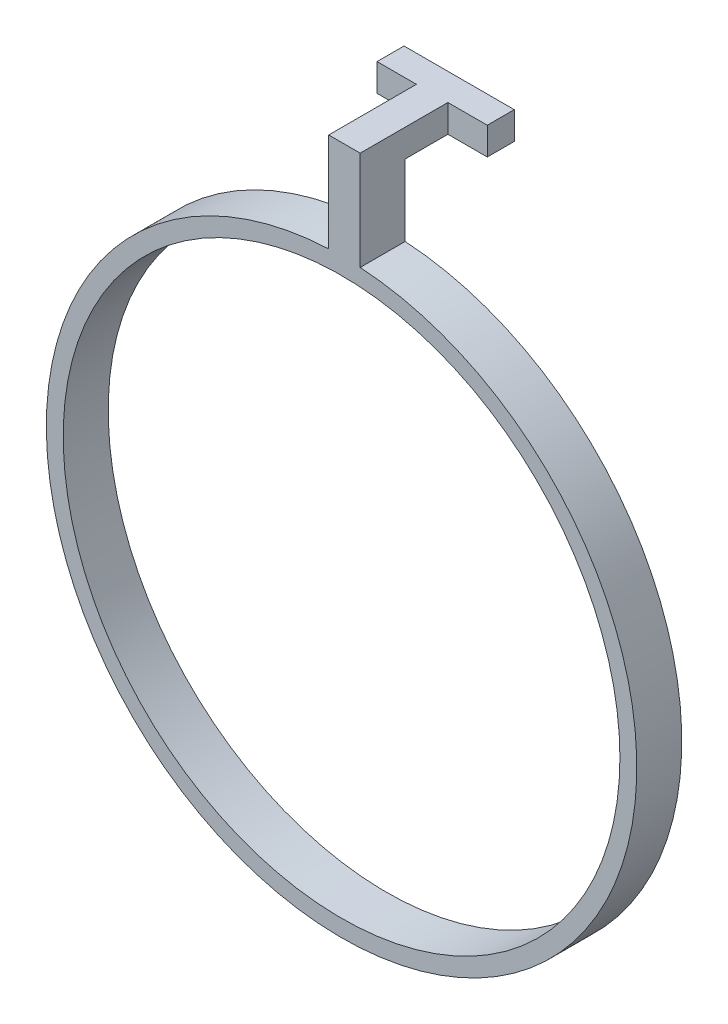
ISO-10303-21;
HEADER;
FILE_DESCRIPTION(('STEP AP214'),'2;1');
FILE_NAME('part.step','',(''),(''),'','','');
FILE_SCHEMA(('AUTOMOTIVE_DESIGN { 1 0 10303 214 1 1 1 1 }'));
ENDSEC;
DATA;
#1=APPLICATION_CONTEXT('core data for automotive mechanical design processes');
#2=APPLICATION_PROTOCOL_DEFINITION('international standard','automotive_design',2000,#1);
#3=PRODUCT_CONTEXT('',#1,'mechanical');
#4=PRODUCT('Part','Part','',(#3));
#5=PRODUCT_RELATED_PRODUCT_CATEGORY('part','',(#4));
#6=PRODUCT_DEFINITION_FORMATION('','',#4);
#7=PRODUCT_DEFINITION_CONTEXT('part definition',#1,'design');
#8=PRODUCT_DEFINITION('design','',#6,#7);
#9=PRODUCT_DEFINITION_SHAPE('','',#8);
#10=(LENGTH_UNIT() NAMED_UNIT(*) SI_UNIT(.MILLI.,.METRE.));
#11=(NAMED_UNIT(*) PLANE_ANGLE_UNIT() SI_UNIT($,.RADIAN.));
#12=(NAMED_UNIT(*) SI_UNIT($,.STERADIAN.) SOLID_ANGLE_UNIT());
#13=UNCERTAINTY_MEASURE_WITH_UNIT(LENGTH_MEASURE(1.E-05),#10,'distance_accuracy_value','');
#14=(GEOMETRIC_REPRESENTATION_CONTEXT(3) GLOBAL_UNCERTAINTY_ASSIGNED_CONTEXT((#13)) GLOBAL_UNIT_ASSIGNED_CONTEXT((#10,
#11,#12)) REPRESENTATION_CONTEXT('',''));
#15=CARTESIAN_POINT('',(0.,0.,0.));
#16=DIRECTION('',(0.,0.,1.));
#17=DIRECTION('',(1.,0.,0.));
#18=AXIS2_PLACEMENT_3D('',#15,#16,#17);
#19=CARTESIAN_POINT('',(0.,0.,0.));
#20=DIRECTION('',(0.,0.,1.));
#21=DIRECTION('',(1.,0.,0.));
#22=AXIS2_PLACEMENT_3D('',#19,#20,#21);
#23=PLANE('',#22);
#24=CARTESIAN_POINT('',(0.,0.,0.));
#25=DIRECTION('',(0.,0.,1.));
#26=DIRECTION('',(1.,0.,0.));
#27=AXIS2_PLACEMENT_3D('',#24,#25,#26);
#28=CIRCLE('',#27,24.75);
#29=CARTESIAN_POINT('',(24.75,0.,0.));
#30=VERTEX_POINT('',#29);
#31=EDGE_CURVE('E163',#30,#30,#28,.T.);
#32=ORIENTED_EDGE('',*,*,#31,.T.);
#33=EDGE_LOOP('',(#32));
#34=FACE_BOUND('',#33,.T.);
#35=DIRECTION('',(-1.,0.,0.));
#36=VECTOR('',#35,1.);
#37=CARTESIAN_POINT('',(1.65514018691589,32.55,0.));
#38=LINE('',#37,#36);
#39=CARTESIAN_POINT('',(1.65514018691589,32.55,0.));
#40=VERTEX_POINT('',#39);
#41=CARTESIAN_POINT('',(-1.14485981308411,32.55,0.));
#42=VERTEX_POINT('',#41);
#43=EDGE_CURVE('E52',#40,#42,#38,.T.);
#44=ORIENTED_EDGE('',*,*,#43,.F.);
#45=DIRECTION('',(0.,1.,0.));
#46=VECTOR('',#45,1.);
#47=CARTESIAN_POINT('',(1.65514018691589,35.,0.));
#48=LINE('',#47,#46);
#49=CARTESIAN_POINT('',(1.65514018691589,26.1977672896309,0.));
#50=VERTEX_POINT('',#49);
#51=EDGE_CURVE('E172',#50,#40,#48,.T.);
#52=ORIENTED_EDGE('',*,*,#51,.F.);
#53=CARTESIAN_POINT('',(0.,0.,0.));
#54=DIRECTION('',(0.,0.,1.));
#55=DIRECTION('',(1.,0.,0.));
#56=AXIS2_PLACEMENT_3D('',#53,#54,#55);
#57=CIRCLE('',#56,26.25);
#58=CARTESIAN_POINT('',(-1.14485981308411,26.2250223261752,0.));
#59=VERTEX_POINT('',#58);
#60=EDGE_CURVE('E76',#59,#50,#57,.T.);
#61=ORIENTED_EDGE('',*,*,#60,.F.);
#62=DIRECTION('',(0.,-1.,0.));
#63=VECTOR('',#62,1.);
#64=CARTESIAN_POINT('',(-1.14485981308411,35.,0.));
#65=LINE('',#64,#63);
#66=EDGE_CURVE('E167',#42,#59,#65,.T.);
#67=ORIENTED_EDGE('',*,*,#66,.F.);
#68=EDGE_LOOP('',(#44,#52,#61,#67));
#69=FACE_BOUND('',#68,.T.);
#70=ADVANCED_FACE('F37',(#34,#69),#23,.F.);
#71=CARTESIAN_POINT('',(0.,0.,4.));
#72=DIRECTION('',(0.,0.,1.));
#73=DIRECTION('',(1.,0.,0.));
#74=AXIS2_PLACEMENT_3D('',#71,#72,#73);
#75=PLANE('',#74);
#76=DIRECTION('',(0.,-1.,0.));
#77=VECTOR('',#76,1.);
#78=CARTESIAN_POINT('',(-1.14485981308411,35.,4.));
#79=LINE('',#78,#77);
#80=CARTESIAN_POINT('',(-1.14485981308411,35.,4.));
#81=VERTEX_POINT('',#80);
#82=CARTESIAN_POINT('',(-1.14485981308411,26.2250223261752,4.));
#83=VERTEX_POINT('',#82);
#84=EDGE_CURVE('E170',#81,#83,#79,.T.);
#85=ORIENTED_EDGE('',*,*,#84,.T.);
#86=CARTESIAN_POINT('',(0.,0.,4.));
#87=DIRECTION('',(0.,0.,1.));
#88=DIRECTION('',(1.,0.,0.));
#89=AXIS2_PLACEMENT_3D('',#86,#87,#88);
#90=CIRCLE('',#89,26.25);
#91=CARTESIAN_POINT('',(1.65514018691589,26.1977672896309,4.));
#92=VERTEX_POINT('',#91);
#93=EDGE_CURVE('E81',#83,#92,#90,.T.);
#94=ORIENTED_EDGE('',*,*,#93,.T.);
#95=DIRECTION('',(0.,1.,0.));
#96=VECTOR('',#95,1.);
#97=CARTESIAN_POINT('',(1.65514018691589,35.,4.));
#98=LINE('',#97,#96);
#99=CARTESIAN_POINT('',(1.65514018691589,35.,4.));
#100=VERTEX_POINT('',#99);
#101=EDGE_CURVE('E174',#92,#100,#98,.T.);
#102=ORIENTED_EDGE('',*,*,#101,.T.);
#103=DIRECTION('',(-1.,0.,0.));
#104=VECTOR('',#103,1.);
#105=CARTESIAN_POINT('',(-1.14485981308411,35.,4.));
#106=LINE('',#105,#104);
#107=EDGE_CURVE('E61',#100,#81,#106,.T.);
#108=ORIENTED_EDGE('',*,*,#107,.T.);
#109=EDGE_LOOP('',(#85,#94,#102,#108));
#110=FACE_BOUND('',#109,.T.);
#111=CARTESIAN_POINT('',(0.,0.,4.));
#112=DIRECTION('',(0.,0.,1.));
#113=DIRECTION('',(1.,0.,0.));
#114=AXIS2_PLACEMENT_3D('',#111,#112,#113);
#115=CIRCLE('',#114,24.75);
#116=CARTESIAN_POINT('',(24.75,0.,4.));
#117=VERTEX_POINT('',#116);
#118=EDGE_CURVE('E164',#117,#117,#115,.T.);
#119=ORIENTED_EDGE('',*,*,#118,.F.);
#120=EDGE_LOOP('',(#119));
#121=FACE_BOUND('',#120,.T.);
#122=ADVANCED_FACE('F229',(#110,#121),#75,.T.);
#123=CARTESIAN_POINT('',(-1.14485981308411,35.,4.));
#124=DIRECTION('',(1.,0.,0.));
#125=DIRECTION('',(0.,1.,0.));
#126=AXIS2_PLACEMENT_3D('',#123,#124,#125);
#127=PLANE('',#126);
#128=DIRECTION('',(0.,0.,-1.));
#129=VECTOR('',#128,1.);
#130=CARTESIAN_POINT('',(-1.14485981308411,35.,4.));
#131=LINE('',#130,#129);
#132=CARTESIAN_POINT('',(-1.14485981308411,35.,-3.8));
#133=VERTEX_POINT('',#132);
#134=EDGE_CURVE('E177',#81,#133,#131,.T.);
#135=ORIENTED_EDGE('',*,*,#134,.T.);
#136=DIRECTION('',(0.,1.,0.));
#137=VECTOR('',#136,1.);
#138=CARTESIAN_POINT('',(-1.14485981308411,35.,-3.8));
#139=LINE('',#138,#137);
#140=CARTESIAN_POINT('',(-1.14485981308411,32.55,-3.8));
#141=VERTEX_POINT('',#140);
#142=EDGE_CURVE('E155',#141,#133,#139,.T.);
#143=ORIENTED_EDGE('',*,*,#142,.F.);
#144=DIRECTION('',(0.,0.,1.));
#145=VECTOR('',#144,1.);
#146=CARTESIAN_POINT('',(-1.14485981308411,32.55,-3.8));
#147=LINE('',#146,#145);
#148=EDGE_CURVE('E157',#141,#42,#147,.T.);
#149=ORIENTED_EDGE('',*,*,#148,.T.);
#150=ORIENTED_EDGE('',*,*,#66,.T.);
#151=DIRECTION('',(0.,0.,-1.));
#152=VECTOR('',#151,1.);
#153=CARTESIAN_POINT('',(-1.14485981308411,26.2250223261752,4.));
#154=LINE('',#153,#152);
#155=EDGE_CURVE('E11',#83,#59,#154,.T.);
#156=ORIENTED_EDGE('',*,*,#155,.F.);
#157=ORIENTED_EDGE('',*,*,#84,.F.);
#158=EDGE_LOOP('',(#135,#143,#149,#150,#156,#157));
#159=FACE_BOUND('',#158,.T.);
#160=ADVANCED_FACE('F39',(#159),#127,.F.);
#161=CARTESIAN_POINT('',(0.,0.,4.));
#162=DIRECTION('',(0.,0.,-1.));
#163=DIRECTION('',(-1.,0.,0.));
#164=AXIS2_PLACEMENT_3D('',#161,#162,#163);
#165=CYLINDRICAL_SURFACE('',#164,26.25);
#166=ORIENTED_EDGE('',*,*,#60,.T.);
#167=DIRECTION('',(0.,0.,-1.));
#168=VECTOR('',#167,1.);
#169=CARTESIAN_POINT('',(1.65514018691589,26.1977672896309,4.));
#170=LINE('',#169,#168);
#171=EDGE_CURVE('E45',#92,#50,#170,.T.);
#172=ORIENTED_EDGE('',*,*,#171,.F.);
#173=ORIENTED_EDGE('',*,*,#93,.F.);
#174=ORIENTED_EDGE('',*,*,#155,.T.);
#175=EDGE_LOOP('',(#166,#172,#173,#174));
#176=FACE_BOUND('',#175,.T.);
#177=ADVANCED_FACE('F188',(#176),#165,.T.);
#178=CARTESIAN_POINT('',(1.65514018691589,35.,4.));
#179=DIRECTION('',(-1.,0.,0.));
#180=DIRECTION('',(0.,-1.,0.));
#181=AXIS2_PLACEMENT_3D('',#178,#179,#180);
#182=PLANE('',#181);
#183=ORIENTED_EDGE('',*,*,#51,.T.);
#184=DIRECTION('',(0.,0.,1.));
#185=VECTOR('',#184,1.);
#186=CARTESIAN_POINT('',(1.65514018691589,32.55,-3.8));
#187=LINE('',#186,#185);
#188=CARTESIAN_POINT('',(1.65514018691589,32.55,-3.8));
#189=VERTEX_POINT('',#188);
#190=EDGE_CURVE('E161',#189,#40,#187,.T.);
#191=ORIENTED_EDGE('',*,*,#190,.F.);
#192=DIRECTION('',(0.,-1.,0.));
#193=VECTOR('',#192,1.);
#194=CARTESIAN_POINT('',(1.65514018691589,35.,-3.8));
#195=LINE('',#194,#193);
#196=CARTESIAN_POINT('',(1.65514018691589,35.,-3.8));
#197=VERTEX_POINT('',#196);
#198=EDGE_CURVE('E147',#197,#189,#195,.T.);
#199=ORIENTED_EDGE('',*,*,#198,.F.);
#200=DIRECTION('',(0.,0.,-1.));
#201=VECTOR('',#200,1.);
#202=CARTESIAN_POINT('',(1.65514018691589,35.,4.));
#203=LINE('',#202,#201);
#204=EDGE_CURVE('E182',#100,#197,#203,.T.);
#205=ORIENTED_EDGE('',*,*,#204,.F.);
#206=ORIENTED_EDGE('',*,*,#101,.F.);
#207=ORIENTED_EDGE('',*,*,#171,.T.);
#208=EDGE_LOOP('',(#183,#191,#199,#205,#206,#207));
#209=FACE_BOUND('',#208,.T.);
#210=ADVANCED_FACE('F185',(#209),#182,.F.);
#211=CARTESIAN_POINT('',(-1.14485981308411,35.,4.));
#212=DIRECTION('',(0.,-1.,0.));
#213=DIRECTION('',(0.,0.,-1.));
#214=AXIS2_PLACEMENT_3D('',#211,#212,#213);
#215=PLANE('',#214);
#216=ORIENTED_EDGE('',*,*,#204,.T.);
#217=DIRECTION('',(-1.,0.,0.));
#218=VECTOR('',#217,1.);
#219=CARTESIAN_POINT('',(5.15514018691589,35.,-3.8));
#220=LINE('',#219,#218);
#221=CARTESIAN_POINT('',(5.15514018691589,35.,-3.8));
#222=VERTEX_POINT('',#221);
#223=EDGE_CURVE('E194',#222,#197,#220,.T.);
#224=ORIENTED_EDGE('',*,*,#223,.F.);
#225=DIRECTION('',(0.,0.,1.));
#226=VECTOR('',#225,1.);
#227=CARTESIAN_POINT('',(5.15514018691589,35.,-3.8));
#228=LINE('',#227,#226);
#229=CARTESIAN_POINT('',(5.15514018691589,35.,-6.2));
#230=VERTEX_POINT('',#229);
#231=EDGE_CURVE('E138',#230,#222,#228,.T.);
#232=ORIENTED_EDGE('',*,*,#231,.F.);
#233=DIRECTION('',(-1.,0.,0.));
#234=VECTOR('',#233,1.);
#235=CARTESIAN_POINT('',(5.15514018691589,35.,-6.2));
#236=LINE('',#235,#234);
#237=CARTESIAN_POINT('',(-4.64485981308411,35.,-6.2));
#238=VERTEX_POINT('',#237);
#239=EDGE_CURVE('E196',#230,#238,#236,.T.);
#240=ORIENTED_EDGE('',*,*,#239,.T.);
#241=DIRECTION('',(0.,0.,1.));
#242=VECTOR('',#241,1.);
#243=CARTESIAN_POINT('',(-4.64485981308411,35.,-3.8));
#244=LINE('',#243,#242);
#245=CARTESIAN_POINT('',(-4.64485981308411,35.,-3.8));
#246=VERTEX_POINT('',#245);
#247=EDGE_CURVE('E142',#238,#246,#244,.T.);
#248=ORIENTED_EDGE('',*,*,#247,.T.);
#249=EDGE_CURVE('E197',#133,#246,#220,.T.);
#250=ORIENTED_EDGE('',*,*,#249,.F.);
#251=ORIENTED_EDGE('',*,*,#134,.F.);
#252=ORIENTED_EDGE('',*,*,#107,.F.);
#253=EDGE_LOOP('',(#216,#224,#232,#240,#248,#250,#251,#252));
#254=FACE_BOUND('',#253,.T.);
#255=ADVANCED_FACE('F216',(#254),#215,.F.);
#256=CARTESIAN_POINT('',(0.,0.,4.));
#257=DIRECTION('',(0.,0.,-1.));
#258=DIRECTION('',(-1.,0.,0.));
#259=AXIS2_PLACEMENT_3D('',#256,#257,#258);
#260=CYLINDRICAL_SURFACE('',#259,24.75);
#261=ORIENTED_EDGE('',*,*,#118,.T.);
#262=EDGE_LOOP('',(#261));
#263=FACE_BOUND('',#262,.T.);
#264=ORIENTED_EDGE('',*,*,#31,.F.);
#265=EDGE_LOOP('',(#264));
#266=FACE_BOUND('',#265,.T.);
#267=ADVANCED_FACE('F218',(#263,#266),#260,.F.);
#268=CARTESIAN_POINT('',(1.65514018691589,32.55,-3.8));
#269=DIRECTION('',(0.,1.,0.));
#270=DIRECTION('',(0.,0.,1.));
#271=AXIS2_PLACEMENT_3D('',#268,#269,#270);
#272=PLANE('',#271);
#273=ORIENTED_EDGE('',*,*,#43,.T.);
#274=ORIENTED_EDGE('',*,*,#148,.F.);
#275=DIRECTION('',(-1.,0.,0.));
#276=VECTOR('',#275,1.);
#277=CARTESIAN_POINT('',(5.15514018691589,32.55,-3.8));
#278=LINE('',#277,#276);
#279=CARTESIAN_POINT('',(-4.64485981308411,32.55,-3.8));
#280=VERTEX_POINT('',#279);
#281=EDGE_CURVE('E148',#141,#280,#278,.T.);
#282=ORIENTED_EDGE('',*,*,#281,.T.);
#283=DIRECTION('',(0.,0.,-1.));
#284=VECTOR('',#283,1.);
#285=CARTESIAN_POINT('',(-4.64485981308411,32.55,-3.8));
#286=LINE('',#285,#284);
#287=CARTESIAN_POINT('',(-4.64485981308411,32.55,-6.2));
#288=VERTEX_POINT('',#287);
#289=EDGE_CURVE('E205',#280,#288,#286,.T.);
#290=ORIENTED_EDGE('',*,*,#289,.T.);
#291=DIRECTION('',(-1.,0.,0.));
#292=VECTOR('',#291,1.);
#293=CARTESIAN_POINT('',(5.15514018691589,32.55,-6.2));
#294=LINE('',#293,#292);
#295=CARTESIAN_POINT('',(5.15514018691589,32.55,-6.2));
#296=VERTEX_POINT('',#295);
#297=EDGE_CURVE('E129',#296,#288,#294,.T.);
#298=ORIENTED_EDGE('',*,*,#297,.F.);
#299=DIRECTION('',(0.,0.,-1.));
#300=VECTOR('',#299,1.);
#301=CARTESIAN_POINT('',(5.15514018691589,32.55,-3.8));
#302=LINE('',#301,#300);
#303=CARTESIAN_POINT('',(5.15514018691589,32.55,-3.8));
#304=VERTEX_POINT('',#303);
#305=EDGE_CURVE('E122',#304,#296,#302,.T.);
#306=ORIENTED_EDGE('',*,*,#305,.F.);
#307=EDGE_CURVE('E127',#304,#189,#278,.T.);
#308=ORIENTED_EDGE('',*,*,#307,.T.);
#309=ORIENTED_EDGE('',*,*,#190,.T.);
#310=EDGE_LOOP('',(#273,#274,#282,#290,#298,#306,#308,#309));
#311=FACE_BOUND('',#310,.T.);
#312=ADVANCED_FACE('F124',(#311),#272,.F.);
#313=CARTESIAN_POINT('',(5.15514018691589,35.,-3.8));
#314=DIRECTION('',(0.,0.,-1.));
#315=DIRECTION('',(0.,1.,0.));
#316=AXIS2_PLACEMENT_3D('',#313,#314,#315);
#317=PLANE('',#316);
#318=ORIENTED_EDGE('',*,*,#223,.T.);
#319=ORIENTED_EDGE('',*,*,#198,.T.);
#320=ORIENTED_EDGE('',*,*,#307,.F.);
#321=DIRECTION('',(0.,-1.,0.));
#322=VECTOR('',#321,1.);
#323=CARTESIAN_POINT('',(5.15514018691589,35.,-3.8));
#324=LINE('',#323,#322);
#325=EDGE_CURVE('E133',#222,#304,#324,.T.);
#326=ORIENTED_EDGE('',*,*,#325,.F.);
#327=EDGE_LOOP('',(#318,#319,#320,#326));
#328=FACE_BOUND('',#327,.T.);
#329=ADVANCED_FACE('F145',(#328),#317,.F.);
#330=ORIENTED_EDGE('',*,*,#281,.F.);
#331=ORIENTED_EDGE('',*,*,#142,.T.);
#332=ORIENTED_EDGE('',*,*,#249,.T.);
#333=DIRECTION('',(0.,-1.,0.));
#334=VECTOR('',#333,1.);
#335=CARTESIAN_POINT('',(-4.64485981308411,35.,-3.8));
#336=LINE('',#335,#334);
#337=EDGE_CURVE('E207',#246,#280,#336,.T.);
#338=ORIENTED_EDGE('',*,*,#337,.T.);
#339=EDGE_LOOP('',(#330,#331,#332,#338));
#340=FACE_BOUND('',#339,.T.);
#341=ADVANCED_FACE('F240',(#340),#317,.F.);
#342=CARTESIAN_POINT('',(5.15514018691589,35.,-6.2));
#343=DIRECTION('',(0.,0.,1.));
#344=DIRECTION('',(0.,-1.,0.));
#345=AXIS2_PLACEMENT_3D('',#342,#343,#344);
#346=PLANE('',#345);
#347=DIRECTION('',(0.,1.,0.));
#348=VECTOR('',#347,1.);
#349=CARTESIAN_POINT('',(-4.64485981308411,35.,-6.2));
#350=LINE('',#349,#348);
#351=EDGE_CURVE('E203',#288,#238,#350,.T.);
#352=ORIENTED_EDGE('',*,*,#351,.T.);
#353=ORIENTED_EDGE('',*,*,#239,.F.);
#354=DIRECTION('',(0.,1.,0.));
#355=VECTOR('',#354,1.);
#356=CARTESIAN_POINT('',(5.15514018691589,35.,-6.2));
#357=LINE('',#356,#355);
#358=EDGE_CURVE('E132',#296,#230,#357,.T.);
#359=ORIENTED_EDGE('',*,*,#358,.F.);
#360=ORIENTED_EDGE('',*,*,#297,.T.);
#361=EDGE_LOOP('',(#352,#353,#359,#360));
#362=FACE_BOUND('',#361,.T.);
#363=ADVANCED_FACE('F213',(#362),#346,.F.);
#364=CARTESIAN_POINT('',(5.15514018691589,0.,0.));
#365=DIRECTION('',(1.,0.,0.));
#366=DIRECTION('',(0.,0.,-1.));
#367=AXIS2_PLACEMENT_3D('',#364,#365,#366);
#368=PLANE('',#367);
#369=ORIENTED_EDGE('',*,*,#325,.T.);
#370=ORIENTED_EDGE('',*,*,#305,.T.);
#371=ORIENTED_EDGE('',*,*,#358,.T.);
#372=ORIENTED_EDGE('',*,*,#231,.T.);
#373=EDGE_LOOP('',(#369,#370,#371,#372));
#374=FACE_BOUND('',#373,.T.);
#375=ADVANCED_FACE('F136',(#374),#368,.T.);
#376=CARTESIAN_POINT('',(-4.64485981308411,0.,0.));
#377=DIRECTION('',(1.,0.,0.));
#378=DIRECTION('',(0.,0.,-1.));
#379=AXIS2_PLACEMENT_3D('',#376,#377,#378);
#380=PLANE('',#379);
#381=ORIENTED_EDGE('',*,*,#337,.F.);
#382=ORIENTED_EDGE('',*,*,#247,.F.);
#383=ORIENTED_EDGE('',*,*,#351,.F.);
#384=ORIENTED_EDGE('',*,*,#289,.F.);
#385=EDGE_LOOP('',(#381,#382,#383,#384));
#386=FACE_BOUND('',#385,.T.);
#387=ADVANCED_FACE('F243',(#386),#380,.F.);
#388=CLOSED_SHELL('',(#70,#122,#160,#177,#210,#255,#267,#312,#329,#341,#363,#375,#387));
#389=MANIFOLD_SOLID_BREP('B2',#388);
#390=ADVANCED_BREP_SHAPE_REPRESENTATION('',(#18,#389),#14);
#391=SHAPE_DEFINITION_REPRESENTATION(#9,#390);
ENDSEC;
END-ISO-10303-21;
